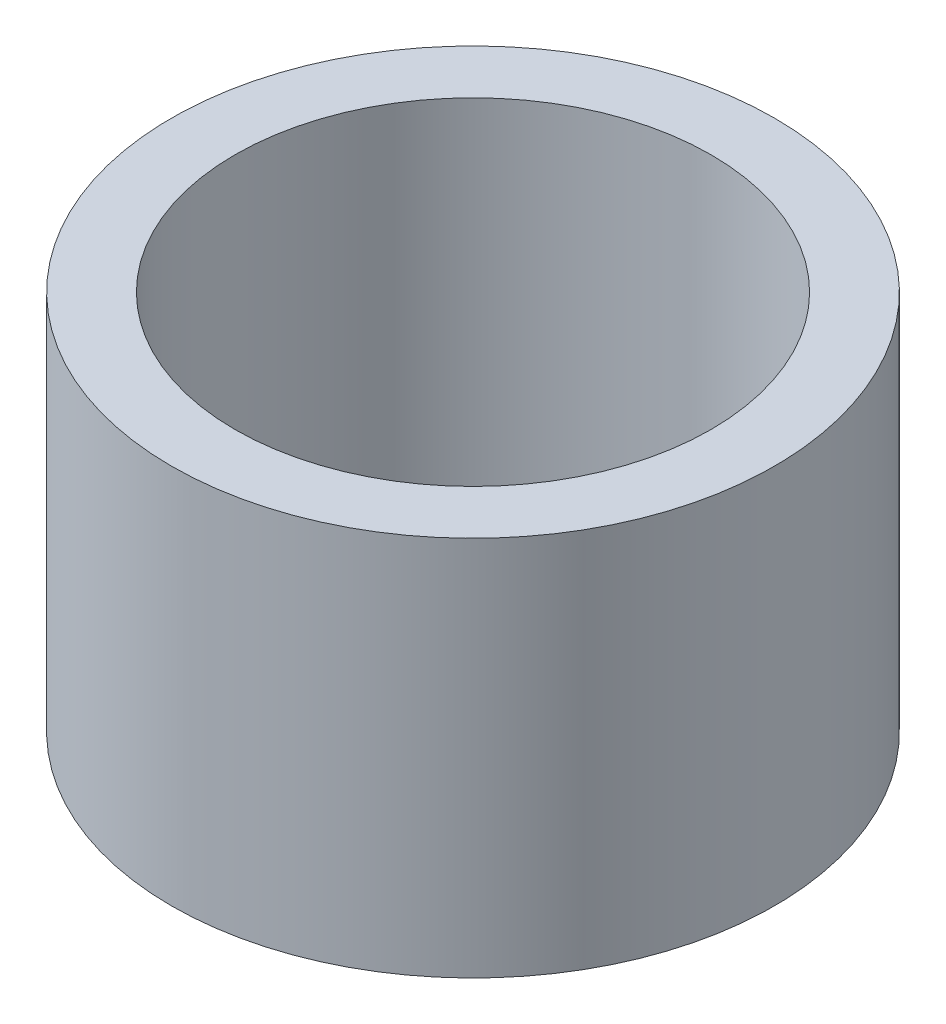
ISO-10303-21;
HEADER;
FILE_DESCRIPTION(('STEP AP214'),'2;1');
FILE_NAME('part.step','',(''),(''),'','','');
FILE_SCHEMA(('AUTOMOTIVE_DESIGN { 1 0 10303 214 1 1 1 1 }'));
ENDSEC;
DATA;
#1=APPLICATION_CONTEXT('core data for automotive mechanical design processes');
#2=APPLICATION_PROTOCOL_DEFINITION('international standard','automotive_design',2000,#1);
#3=PRODUCT_CONTEXT('',#1,'mechanical');
#4=PRODUCT('Part','Part','',(#3));
#5=PRODUCT_RELATED_PRODUCT_CATEGORY('part','',(#4));
#6=PRODUCT_DEFINITION_FORMATION('','',#4);
#7=PRODUCT_DEFINITION_CONTEXT('part definition',#1,'design');
#8=PRODUCT_DEFINITION('design','',#6,#7);
#9=PRODUCT_DEFINITION_SHAPE('','',#8);
#10=(LENGTH_UNIT() NAMED_UNIT(*) SI_UNIT(.MILLI.,.METRE.));
#11=(NAMED_UNIT(*) PLANE_ANGLE_UNIT() SI_UNIT($,.RADIAN.));
#12=(NAMED_UNIT(*) SI_UNIT($,.STERADIAN.) SOLID_ANGLE_UNIT());
#13=UNCERTAINTY_MEASURE_WITH_UNIT(LENGTH_MEASURE(1.E-05),#10,'distance_accuracy_value','');
#14=(GEOMETRIC_REPRESENTATION_CONTEXT(3) GLOBAL_UNCERTAINTY_ASSIGNED_CONTEXT((#13)) GLOBAL_UNIT_ASSIGNED_CONTEXT((#10,
#11,#12)) REPRESENTATION_CONTEXT('',''));
#15=CARTESIAN_POINT('',(0.,0.,0.));
#16=DIRECTION('',(0.,0.,1.));
#17=DIRECTION('',(1.,0.,0.));
#18=AXIS2_PLACEMENT_3D('',#15,#16,#17);
#19=CARTESIAN_POINT('',(0.,12.,0.));
#20=DIRECTION('',(0.,1.,0.));
#21=DIRECTION('',(0.,0.,1.));
#22=AXIS2_PLACEMENT_3D('',#19,#20,#21);
#23=PLANE('',#22);
#24=CARTESIAN_POINT('',(0.,12.,0.));
#25=DIRECTION('',(0.,1.,0.));
#26=DIRECTION('',(0.,0.,1.));
#27=AXIS2_PLACEMENT_3D('',#24,#25,#26);
#28=CIRCLE('',#27,9.5);
#29=CARTESIAN_POINT('',(0.,12.,9.5));
#30=VERTEX_POINT('',#29);
#31=EDGE_CURVE('E10',#30,#30,#28,.T.);
#32=ORIENTED_EDGE('',*,*,#31,.T.);
#33=EDGE_LOOP('',(#32));
#34=FACE_BOUND('',#33,.T.);
#35=CARTESIAN_POINT('',(0.,12.,0.));
#36=DIRECTION('',(0.,1.,0.));
#37=DIRECTION('',(0.,0.,1.));
#38=AXIS2_PLACEMENT_3D('',#35,#36,#37);
#39=CIRCLE('',#38,7.5);
#40=CARTESIAN_POINT('',(0.,12.,7.5));
#41=VERTEX_POINT('',#40);
#42=EDGE_CURVE('E44',#41,#41,#39,.T.);
#43=ORIENTED_EDGE('',*,*,#42,.F.);
#44=EDGE_LOOP('',(#43));
#45=FACE_BOUND('',#44,.T.);
#46=ADVANCED_FACE('F33',(#34,#45),#23,.T.);
#47=CARTESIAN_POINT('',(0.,0.,0.));
#48=DIRECTION('',(0.,1.,0.));
#49=DIRECTION('',(0.,0.,1.));
#50=AXIS2_PLACEMENT_3D('',#47,#48,#49);
#51=PLANE('',#50);
#52=CARTESIAN_POINT('',(0.,0.,0.));
#53=DIRECTION('',(0.,1.,0.));
#54=DIRECTION('',(0.,0.,1.));
#55=AXIS2_PLACEMENT_3D('',#52,#53,#54);
#56=CIRCLE('',#55,9.5);
#57=CARTESIAN_POINT('',(0.,0.,9.5));
#58=VERTEX_POINT('',#57);
#59=EDGE_CURVE('E37',#58,#58,#56,.T.);
#60=ORIENTED_EDGE('',*,*,#59,.F.);
#61=EDGE_LOOP('',(#60));
#62=FACE_BOUND('',#61,.T.);
#63=CARTESIAN_POINT('',(0.,0.,0.));
#64=DIRECTION('',(0.,1.,0.));
#65=DIRECTION('',(0.,0.,1.));
#66=AXIS2_PLACEMENT_3D('',#63,#64,#65);
#67=CIRCLE('',#66,7.5);
#68=CARTESIAN_POINT('',(0.,0.,7.5));
#69=VERTEX_POINT('',#68);
#70=EDGE_CURVE('E46',#69,#69,#67,.T.);
#71=ORIENTED_EDGE('',*,*,#70,.T.);
#72=EDGE_LOOP('',(#71));
#73=FACE_BOUND('',#72,.T.);
#74=ADVANCED_FACE('F56',(#62,#73),#51,.F.);
#75=CARTESIAN_POINT('',(0.,12.,0.));
#76=DIRECTION('',(0.,-1.,0.));
#77=DIRECTION('',(0.,0.,-1.));
#78=AXIS2_PLACEMENT_3D('',#75,#76,#77);
#79=CYLINDRICAL_SURFACE('',#78,9.5);
#80=ORIENTED_EDGE('',*,*,#31,.F.);
#81=EDGE_LOOP('',(#80));
#82=FACE_BOUND('',#81,.T.);
#83=ORIENTED_EDGE('',*,*,#59,.T.);
#84=EDGE_LOOP('',(#83));
#85=FACE_BOUND('',#84,.T.);
#86=ADVANCED_FACE('F35',(#82,#85),#79,.T.);
#87=CARTESIAN_POINT('',(0.,12.,0.));
#88=DIRECTION('',(0.,-1.,0.));
#89=DIRECTION('',(0.,0.,-1.));
#90=AXIS2_PLACEMENT_3D('',#87,#88,#89);
#91=CYLINDRICAL_SURFACE('',#90,7.5);
#92=ORIENTED_EDGE('',*,*,#42,.T.);
#93=EDGE_LOOP('',(#92));
#94=FACE_BOUND('',#93,.T.);
#95=ORIENTED_EDGE('',*,*,#70,.F.);
#96=EDGE_LOOP('',(#95));
#97=FACE_BOUND('',#96,.T.);
#98=ADVANCED_FACE('F52',(#94,#97),#91,.F.);
#99=CLOSED_SHELL('',(#46,#74,#86,#98));
#100=MANIFOLD_SOLID_BREP('B2',#99);
#101=ADVANCED_BREP_SHAPE_REPRESENTATION('',(#18,#100),#14);
#102=SHAPE_DEFINITION_REPRESENTATION(#9,#101);
ENDSEC;
END-ISO-10303-21;
